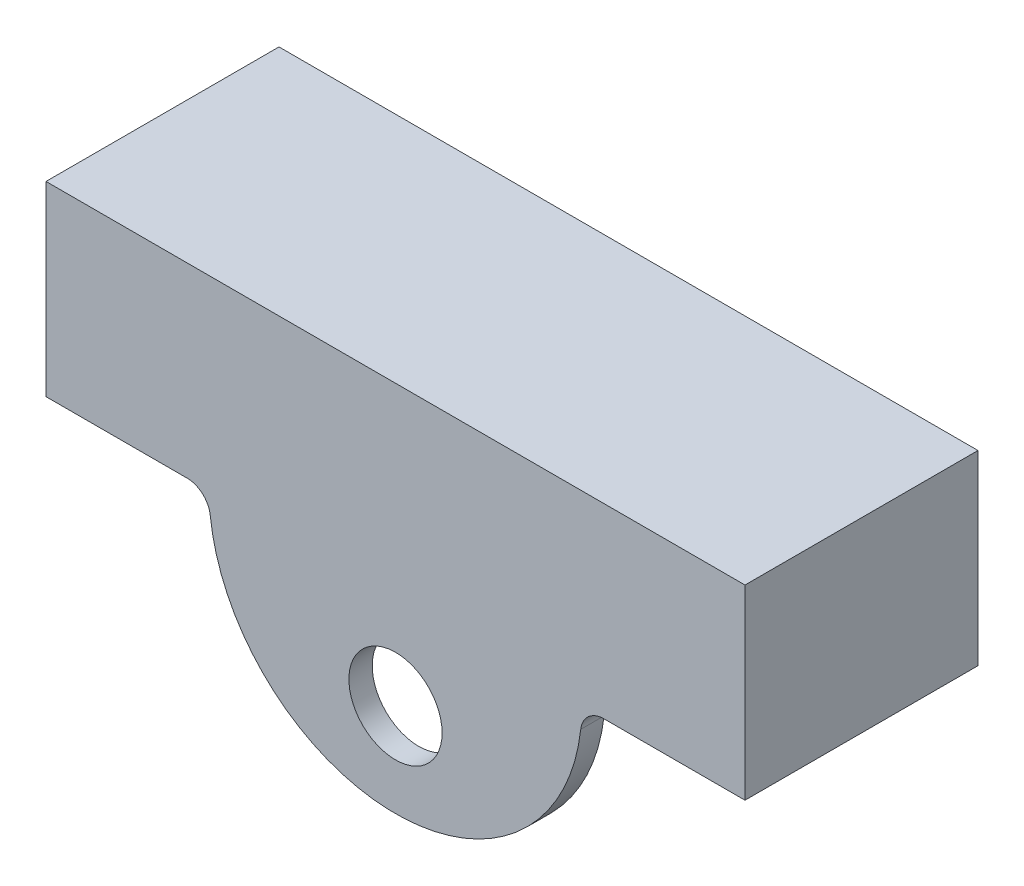
ISO-10303-21;
HEADER;
FILE_DESCRIPTION(('STEP AP214'),'2;1');
FILE_NAME('part.step','',(''),(''),'','','');
FILE_SCHEMA(('AUTOMOTIVE_DESIGN { 1 0 10303 214 1 1 1 1 }'));
ENDSEC;
DATA;
#1=APPLICATION_CONTEXT('core data for automotive mechanical design processes');
#2=APPLICATION_PROTOCOL_DEFINITION('international standard','automotive_design',2000,#1);
#3=PRODUCT_CONTEXT('',#1,'mechanical');
#4=PRODUCT('Part','Part','',(#3));
#5=PRODUCT_RELATED_PRODUCT_CATEGORY('part','',(#4));
#6=PRODUCT_DEFINITION_FORMATION('','',#4);
#7=PRODUCT_DEFINITION_CONTEXT('part definition',#1,'design');
#8=PRODUCT_DEFINITION('design','',#6,#7);
#9=PRODUCT_DEFINITION_SHAPE('','',#8);
#10=(LENGTH_UNIT() NAMED_UNIT(*) SI_UNIT(.MILLI.,.METRE.));
#11=(NAMED_UNIT(*) PLANE_ANGLE_UNIT() SI_UNIT($,.RADIAN.));
#12=(NAMED_UNIT(*) SI_UNIT($,.STERADIAN.) SOLID_ANGLE_UNIT());
#13=UNCERTAINTY_MEASURE_WITH_UNIT(LENGTH_MEASURE(1.E-05),#10,'distance_accuracy_value','');
#14=(GEOMETRIC_REPRESENTATION_CONTEXT(3) GLOBAL_UNCERTAINTY_ASSIGNED_CONTEXT((#13)) GLOBAL_UNIT_ASSIGNED_CONTEXT((#10,
#11,#12)) REPRESENTATION_CONTEXT('',''));
#15=CARTESIAN_POINT('',(0.,0.,0.));
#16=DIRECTION('',(0.,0.,1.));
#17=DIRECTION('',(1.,0.,0.));
#18=AXIS2_PLACEMENT_3D('',#15,#16,#17);
#19=CARTESIAN_POINT('',(0.,-40.,50.));
#20=DIRECTION('',(0.,-1.,0.));
#21=DIRECTION('',(1.,0.,0.));
#22=AXIS2_PLACEMENT_3D('',#19,#20,#21);
#23=PLANE('',#22);
#24=DIRECTION('',(-1.,0.,0.));
#25=VECTOR('',#24,1.);
#26=CARTESIAN_POINT('',(0.,-40.,0.));
#27=LINE('',#26,#25);
#28=CARTESIAN_POINT('',(-44.7213595499958,-40.,0.));
#29=VERTEX_POINT('',#28);
#30=CARTESIAN_POINT('',(-75.,-40.,0.));
#31=VERTEX_POINT('',#30);
#32=EDGE_CURVE('E244',#29,#31,#27,.T.);
#33=ORIENTED_EDGE('',*,*,#32,.F.);
#34=DIRECTION('',(0.,0.,-1.));
#35=VECTOR('',#34,1.);
#36=CARTESIAN_POINT('',(-44.7213595499958,-40.,50.));
#37=LINE('',#36,#35);
#38=CARTESIAN_POINT('',(-44.7213595499958,-40.,5.));
#39=VERTEX_POINT('',#38);
#40=EDGE_CURVE('E280',#29,#39,#37,.F.);
#41=ORIENTED_EDGE('',*,*,#40,.T.);
#42=DIRECTION('',(-1.,0.,0.));
#43=VECTOR('',#42,1.);
#44=CARTESIAN_POINT('',(0.,-40.,5.));
#45=LINE('',#44,#43);
#46=CARTESIAN_POINT('',(-70.,-40.,5.));
#47=VERTEX_POINT('',#46);
#48=EDGE_CURVE('E203',#39,#47,#45,.T.);
#49=ORIENTED_EDGE('',*,*,#48,.T.);
#50=DIRECTION('',(0.,0.,-1.));
#51=VECTOR('',#50,1.);
#52=CARTESIAN_POINT('',(-70.,-40.,50.));
#53=LINE('',#52,#51);
#54=CARTESIAN_POINT('',(-70.,-40.,45.));
#55=VERTEX_POINT('',#54);
#56=EDGE_CURVE('E208',#55,#47,#53,.T.);
#57=ORIENTED_EDGE('',*,*,#56,.F.);
#58=DIRECTION('',(-1.,0.,0.));
#59=VECTOR('',#58,1.);
#60=CARTESIAN_POINT('',(0.,-40.,45.));
#61=LINE('',#60,#59);
#62=CARTESIAN_POINT('',(-44.7213595499958,-40.,45.));
#63=VERTEX_POINT('',#62);
#64=EDGE_CURVE('E206',#63,#55,#61,.T.);
#65=ORIENTED_EDGE('',*,*,#64,.F.);
#66=DIRECTION('',(0.,0.,-1.));
#67=VECTOR('',#66,1.);
#68=CARTESIAN_POINT('',(-44.7213595499958,-40.,50.));
#69=LINE('',#68,#67);
#70=CARTESIAN_POINT('',(-44.7213595499958,-40.,50.));
#71=VERTEX_POINT('',#70);
#72=EDGE_CURVE('E80',#63,#71,#69,.F.);
#73=ORIENTED_EDGE('',*,*,#72,.T.);
#74=DIRECTION('',(-1.,0.,0.));
#75=VECTOR('',#74,1.);
#76=CARTESIAN_POINT('',(0.,-40.,50.));
#77=LINE('',#76,#75);
#78=CARTESIAN_POINT('',(-75.,-40.,50.));
#79=VERTEX_POINT('',#78);
#80=EDGE_CURVE('E228',#71,#79,#77,.T.);
#81=ORIENTED_EDGE('',*,*,#80,.T.);
#82=DIRECTION('',(0.,0.,-1.));
#83=VECTOR('',#82,1.);
#84=CARTESIAN_POINT('',(-75.,-40.,50.));
#85=LINE('',#84,#83);
#86=EDGE_CURVE('E260',#79,#31,#85,.T.);
#87=ORIENTED_EDGE('',*,*,#86,.T.);
#88=EDGE_LOOP('',(#33,#41,#49,#57,#65,#73,#81,#87));
#89=FACE_BOUND('',#88,.T.);
#90=ADVANCED_FACE('F56',(#89),#23,.T.);
#91=CARTESIAN_POINT('',(0.,-40.,50.));
#92=DIRECTION('',(0.,0.,-1.));
#93=DIRECTION('',(-1.,0.,0.));
#94=AXIS2_PLACEMENT_3D('',#91,#92,#93);
#95=CYLINDRICAL_SURFACE('',#94,40.);
#96=CARTESIAN_POINT('',(0.,-40.,0.));
#97=DIRECTION('',(0.,0.,1.));
#98=DIRECTION('',(1.,0.,0.));
#99=AXIS2_PLACEMENT_3D('',#96,#97,#98);
#100=CIRCLE('',#99,40.);
#101=CARTESIAN_POINT('',(-39.7523195999963,-44.4444444444444,0.));
#102=VERTEX_POINT('',#101);
#103=CARTESIAN_POINT('',(39.7523195999963,-44.4444444444444,0.));
#104=VERTEX_POINT('',#103);
#105=EDGE_CURVE('E246',#102,#104,#100,.T.);
#106=ORIENTED_EDGE('',*,*,#105,.T.);
#107=DIRECTION('',(0.,0.,-1.));
#108=VECTOR('',#107,1.);
#109=CARTESIAN_POINT('',(39.7523195999963,-44.4444444444444,50.));
#110=LINE('',#109,#108);
#111=CARTESIAN_POINT('',(39.7523195999963,-44.4444444444444,5.));
#112=VERTEX_POINT('',#111);
#113=EDGE_CURVE('E272',#104,#112,#110,.F.);
#114=ORIENTED_EDGE('',*,*,#113,.T.);
#115=CARTESIAN_POINT('',(0.,-40.,5.));
#116=DIRECTION('',(0.,0.,1.));
#117=DIRECTION('',(1.,0.,0.));
#118=AXIS2_PLACEMENT_3D('',#115,#116,#117);
#119=CIRCLE('',#118,40.);
#120=CARTESIAN_POINT('',(-39.7523195999963,-44.4444444444444,5.));
#121=VERTEX_POINT('',#120);
#122=EDGE_CURVE('E218',#121,#112,#119,.T.);
#123=ORIENTED_EDGE('',*,*,#122,.F.);
#124=DIRECTION('',(0.,0.,-1.));
#125=VECTOR('',#124,1.);
#126=CARTESIAN_POINT('',(-39.7523195999963,-44.4444444444444,50.));
#127=LINE('',#126,#125);
#128=EDGE_CURVE('E269',#121,#102,#127,.T.);
#129=ORIENTED_EDGE('',*,*,#128,.T.);
#130=EDGE_LOOP('',(#106,#114,#123,#129));
#131=FACE_BOUND('',#130,.T.);
#132=ADVANCED_FACE('F339',(#131),#95,.T.);
#133=DIRECTION('',(-1.,0.,0.));
#134=VECTOR('',#133,1.);
#135=CARTESIAN_POINT('',(0.,-40.,5.));
#136=LINE('',#135,#134);
#137=CARTESIAN_POINT('',(70.,-40.,5.));
#138=VERTEX_POINT('',#137);
#139=CARTESIAN_POINT('',(44.7213595499958,-40.,5.));
#140=VERTEX_POINT('',#139);
#141=EDGE_CURVE('E221',#138,#140,#136,.T.);
#142=ORIENTED_EDGE('',*,*,#141,.T.);
#143=DIRECTION('',(0.,0.,-1.));
#144=VECTOR('',#143,1.);
#145=CARTESIAN_POINT('',(44.7213595499958,-40.,50.));
#146=LINE('',#145,#144);
#147=CARTESIAN_POINT('',(44.7213595499958,-40.,0.));
#148=VERTEX_POINT('',#147);
#149=EDGE_CURVE('E266',#140,#148,#146,.T.);
#150=ORIENTED_EDGE('',*,*,#149,.T.);
#151=CARTESIAN_POINT('',(75.,-40.,0.));
#152=VERTEX_POINT('',#151);
#153=EDGE_CURVE('E247',#152,#148,#27,.T.);
#154=ORIENTED_EDGE('',*,*,#153,.F.);
#155=DIRECTION('',(0.,0.,-1.));
#156=VECTOR('',#155,1.);
#157=CARTESIAN_POINT('',(75.,-40.,50.));
#158=LINE('',#157,#156);
#159=CARTESIAN_POINT('',(75.,-40.,50.));
#160=VERTEX_POINT('',#159);
#161=EDGE_CURVE('E258',#160,#152,#158,.T.);
#162=ORIENTED_EDGE('',*,*,#161,.F.);
#163=CARTESIAN_POINT('',(44.7213595499958,-40.,50.));
#164=VERTEX_POINT('',#163);
#165=EDGE_CURVE('E232',#160,#164,#77,.T.);
#166=ORIENTED_EDGE('',*,*,#165,.T.);
#167=DIRECTION('',(0.,0.,-1.));
#168=VECTOR('',#167,1.);
#169=CARTESIAN_POINT('',(44.7213595499958,-40.,50.));
#170=LINE('',#169,#168);
#171=CARTESIAN_POINT('',(44.7213595499958,-40.,45.));
#172=VERTEX_POINT('',#171);
#173=EDGE_CURVE('E263',#164,#172,#170,.T.);
#174=ORIENTED_EDGE('',*,*,#173,.T.);
#175=DIRECTION('',(-1.,0.,0.));
#176=VECTOR('',#175,1.);
#177=CARTESIAN_POINT('',(0.,-40.,45.));
#178=LINE('',#177,#176);
#179=CARTESIAN_POINT('',(70.,-40.,45.));
#180=VERTEX_POINT('',#179);
#181=EDGE_CURVE('E190',#180,#172,#178,.T.);
#182=ORIENTED_EDGE('',*,*,#181,.F.);
#183=DIRECTION('',(0.,0.,-1.));
#184=VECTOR('',#183,1.);
#185=CARTESIAN_POINT('',(70.,-40.,50.));
#186=LINE('',#185,#184);
#187=EDGE_CURVE('E180',#180,#138,#186,.T.);
#188=ORIENTED_EDGE('',*,*,#187,.T.);
#189=EDGE_LOOP('',(#142,#150,#154,#162,#166,#174,#182,#188));
#190=FACE_BOUND('',#189,.T.);
#191=ADVANCED_FACE('F313',(#190),#23,.T.);
#192=CARTESIAN_POINT('',(0.,-40.,45.));
#193=DIRECTION('',(0.,0.,1.));
#194=DIRECTION('',(1.,0.,0.));
#195=AXIS2_PLACEMENT_3D('',#192,#193,#194);
#196=CIRCLE('',#195,40.);
#197=CARTESIAN_POINT('',(-39.7523195999963,-44.4444444444444,45.));
#198=VERTEX_POINT('',#197);
#199=CARTESIAN_POINT('',(39.7523195999963,-44.4444444444444,45.));
#200=VERTEX_POINT('',#199);
#201=EDGE_CURVE('E210',#198,#200,#196,.T.);
#202=ORIENTED_EDGE('',*,*,#201,.T.);
#203=DIRECTION('',(0.,0.,-1.));
#204=VECTOR('',#203,1.);
#205=CARTESIAN_POINT('',(39.7523195999963,-44.4444444444444,50.));
#206=LINE('',#205,#204);
#207=CARTESIAN_POINT('',(39.7523195999963,-44.4444444444444,50.));
#208=VERTEX_POINT('',#207);
#209=EDGE_CURVE('E277',#200,#208,#206,.F.);
#210=ORIENTED_EDGE('',*,*,#209,.T.);
#211=CARTESIAN_POINT('',(0.,-40.,50.));
#212=DIRECTION('',(0.,0.,1.));
#213=DIRECTION('',(1.,0.,0.));
#214=AXIS2_PLACEMENT_3D('',#211,#212,#213);
#215=CIRCLE('',#214,40.);
#216=CARTESIAN_POINT('',(-39.7523195999963,-44.4444444444444,50.));
#217=VERTEX_POINT('',#216);
#218=EDGE_CURVE('E231',#217,#208,#215,.T.);
#219=ORIENTED_EDGE('',*,*,#218,.F.);
#220=DIRECTION('',(0.,0.,-1.));
#221=VECTOR('',#220,1.);
#222=CARTESIAN_POINT('',(-39.7523195999963,-44.4444444444444,50.));
#223=LINE('',#222,#221);
#224=EDGE_CURVE('E274',#217,#198,#223,.T.);
#225=ORIENTED_EDGE('',*,*,#224,.T.);
#226=EDGE_LOOP('',(#202,#210,#219,#225));
#227=FACE_BOUND('',#226,.T.);
#228=ADVANCED_FACE('F304',(#227),#95,.T.);
#229=CARTESIAN_POINT('',(75.,0.,50.));
#230=DIRECTION('',(1.,0.,0.));
#231=DIRECTION('',(0.,1.,0.));
#232=AXIS2_PLACEMENT_3D('',#229,#230,#231);
#233=PLANE('',#232);
#234=DIRECTION('',(0.,-1.,0.));
#235=VECTOR('',#234,1.);
#236=CARTESIAN_POINT('',(75.,0.,0.));
#237=LINE('',#236,#235);
#238=CARTESIAN_POINT('',(75.,0.,0.));
#239=VERTEX_POINT('',#238);
#240=EDGE_CURVE('E250',#239,#152,#237,.T.);
#241=ORIENTED_EDGE('',*,*,#240,.F.);
#242=DIRECTION('',(0.,0.,-1.));
#243=VECTOR('',#242,1.);
#244=CARTESIAN_POINT('',(75.,0.,50.));
#245=LINE('',#244,#243);
#246=CARTESIAN_POINT('',(75.,0.,50.));
#247=VERTEX_POINT('',#246);
#248=EDGE_CURVE('E256',#247,#239,#245,.T.);
#249=ORIENTED_EDGE('',*,*,#248,.F.);
#250=DIRECTION('',(0.,-1.,0.));
#251=VECTOR('',#250,1.);
#252=CARTESIAN_POINT('',(75.,0.,50.));
#253=LINE('',#252,#251);
#254=EDGE_CURVE('E235',#247,#160,#253,.T.);
#255=ORIENTED_EDGE('',*,*,#254,.T.);
#256=ORIENTED_EDGE('',*,*,#161,.T.);
#257=EDGE_LOOP('',(#241,#249,#255,#256));
#258=FACE_BOUND('',#257,.T.);
#259=ADVANCED_FACE('F318',(#258),#233,.T.);
#260=CARTESIAN_POINT('',(0.,0.,50.));
#261=DIRECTION('',(0.,1.,0.));
#262=DIRECTION('',(-1.,0.,0.));
#263=AXIS2_PLACEMENT_3D('',#260,#261,#262);
#264=PLANE('',#263);
#265=DIRECTION('',(1.,0.,0.));
#266=VECTOR('',#265,1.);
#267=CARTESIAN_POINT('',(0.,0.,0.));
#268=LINE('',#267,#266);
#269=CARTESIAN_POINT('',(-75.,0.,0.));
#270=VERTEX_POINT('',#269);
#271=EDGE_CURVE('E229',#270,#239,#268,.T.);
#272=ORIENTED_EDGE('',*,*,#271,.F.);
#273=DIRECTION('',(0.,0.,-1.));
#274=VECTOR('',#273,1.);
#275=CARTESIAN_POINT('',(-75.,0.,50.));
#276=LINE('',#275,#274);
#277=CARTESIAN_POINT('',(-75.,0.,50.));
#278=VERTEX_POINT('',#277);
#279=EDGE_CURVE('E241',#278,#270,#276,.T.);
#280=ORIENTED_EDGE('',*,*,#279,.F.);
#281=DIRECTION('',(1.,0.,0.));
#282=VECTOR('',#281,1.);
#283=CARTESIAN_POINT('',(0.,0.,50.));
#284=LINE('',#283,#282);
#285=EDGE_CURVE('E238',#278,#247,#284,.T.);
#286=ORIENTED_EDGE('',*,*,#285,.T.);
#287=ORIENTED_EDGE('',*,*,#248,.T.);
#288=EDGE_LOOP('',(#272,#280,#286,#287));
#289=FACE_BOUND('',#288,.T.);
#290=ADVANCED_FACE('F322',(#289),#264,.T.);
#291=CARTESIAN_POINT('',(-75.,0.,50.));
#292=DIRECTION('',(-1.,0.,0.));
#293=DIRECTION('',(0.,-1.,0.));
#294=AXIS2_PLACEMENT_3D('',#291,#292,#293);
#295=PLANE('',#294);
#296=DIRECTION('',(0.,1.,0.));
#297=VECTOR('',#296,1.);
#298=CARTESIAN_POINT('',(-75.,0.,0.));
#299=LINE('',#298,#297);
#300=EDGE_CURVE('E216',#31,#270,#299,.T.);
#301=ORIENTED_EDGE('',*,*,#300,.F.);
#302=ORIENTED_EDGE('',*,*,#86,.F.);
#303=DIRECTION('',(0.,1.,0.));
#304=VECTOR('',#303,1.);
#305=CARTESIAN_POINT('',(-75.,0.,50.));
#306=LINE('',#305,#304);
#307=EDGE_CURVE('E225',#79,#278,#306,.T.);
#308=ORIENTED_EDGE('',*,*,#307,.T.);
#309=ORIENTED_EDGE('',*,*,#279,.T.);
#310=EDGE_LOOP('',(#301,#302,#308,#309));
#311=FACE_BOUND('',#310,.T.);
#312=ADVANCED_FACE('F326',(#311),#295,.T.);
#313=CARTESIAN_POINT('',(0.,0.,0.));
#314=DIRECTION('',(0.,0.,1.));
#315=DIRECTION('',(1.,0.,0.));
#316=AXIS2_PLACEMENT_3D('',#313,#314,#315);
#317=PLANE('',#316);
#318=CARTESIAN_POINT('',(0.,-60.,0.));
#319=DIRECTION('',(0.,0.,1.));
#320=DIRECTION('',(1.,0.,0.));
#321=AXIS2_PLACEMENT_3D('',#318,#319,#320);
#322=CIRCLE('',#321,10.);
#323=CARTESIAN_POINT('',(10.,-60.,0.));
#324=VERTEX_POINT('',#323);
#325=EDGE_CURVE('E204',#324,#324,#322,.T.);
#326=ORIENTED_EDGE('',*,*,#325,.T.);
#327=EDGE_LOOP('',(#326));
#328=FACE_BOUND('',#327,.T.);
#329=ORIENTED_EDGE('',*,*,#300,.T.);
#330=ORIENTED_EDGE('',*,*,#271,.T.);
#331=ORIENTED_EDGE('',*,*,#240,.T.);
#332=ORIENTED_EDGE('',*,*,#153,.T.);
#333=CARTESIAN_POINT('',(44.7213595499958,-45.,0.));
#334=DIRECTION('',(0.,0.,1.));
#335=DIRECTION('',(1.,0.,0.));
#336=AXIS2_PLACEMENT_3D('',#333,#334,#335);
#337=CIRCLE('',#336,5.);
#338=EDGE_CURVE('E282',#148,#104,#337,.T.);
#339=ORIENTED_EDGE('',*,*,#338,.T.);
#340=ORIENTED_EDGE('',*,*,#105,.F.);
#341=CARTESIAN_POINT('',(-44.7213595499958,-45.,0.));
#342=DIRECTION('',(0.,0.,1.));
#343=DIRECTION('',(1.,0.,0.));
#344=AXIS2_PLACEMENT_3D('',#341,#342,#343);
#345=CIRCLE('',#344,5.);
#346=EDGE_CURVE('E72',#102,#29,#345,.T.);
#347=ORIENTED_EDGE('',*,*,#346,.T.);
#348=ORIENTED_EDGE('',*,*,#32,.T.);
#349=EDGE_LOOP('',(#329,#330,#331,#332,#339,#340,#347,#348));
#350=FACE_BOUND('',#349,.T.);
#351=ADVANCED_FACE('F344',(#328,#350),#317,.F.);
#352=CARTESIAN_POINT('',(0.,0.,50.));
#353=DIRECTION('',(0.,0.,1.));
#354=DIRECTION('',(1.,0.,0.));
#355=AXIS2_PLACEMENT_3D('',#352,#353,#354);
#356=PLANE('',#355);
#357=CARTESIAN_POINT('',(0.,-60.,50.));
#358=DIRECTION('',(0.,0.,1.));
#359=DIRECTION('',(1.,0.,0.));
#360=AXIS2_PLACEMENT_3D('',#357,#358,#359);
#361=CIRCLE('',#360,10.);
#362=CARTESIAN_POINT('',(10.,-60.,50.));
#363=VERTEX_POINT('',#362);
#364=EDGE_CURVE('E411',#363,#363,#361,.T.);
#365=ORIENTED_EDGE('',*,*,#364,.F.);
#366=EDGE_LOOP('',(#365));
#367=FACE_BOUND('',#366,.T.);
#368=ORIENTED_EDGE('',*,*,#307,.F.);
#369=ORIENTED_EDGE('',*,*,#80,.F.);
#370=CARTESIAN_POINT('',(-44.7213595499958,-45.,50.));
#371=DIRECTION('',(0.,0.,1.));
#372=DIRECTION('',(1.,0.,0.));
#373=AXIS2_PLACEMENT_3D('',#370,#371,#372);
#374=CIRCLE('',#373,5.);
#375=EDGE_CURVE('E12',#71,#217,#374,.F.);
#376=ORIENTED_EDGE('',*,*,#375,.T.);
#377=ORIENTED_EDGE('',*,*,#218,.T.);
#378=CARTESIAN_POINT('',(44.7213595499958,-45.,50.));
#379=DIRECTION('',(0.,0.,1.));
#380=DIRECTION('',(1.,0.,0.));
#381=AXIS2_PLACEMENT_3D('',#378,#379,#380);
#382=CIRCLE('',#381,5.);
#383=EDGE_CURVE('E288',#208,#164,#382,.F.);
#384=ORIENTED_EDGE('',*,*,#383,.T.);
#385=ORIENTED_EDGE('',*,*,#165,.F.);
#386=ORIENTED_EDGE('',*,*,#254,.F.);
#387=ORIENTED_EDGE('',*,*,#285,.F.);
#388=EDGE_LOOP('',(#368,#369,#376,#377,#384,#385,#386,#387));
#389=FACE_BOUND('',#388,.T.);
#390=ADVANCED_FACE('F301',(#367,#389),#356,.T.);
#391=CARTESIAN_POINT('',(70.,0.,50.));
#392=DIRECTION('',(1.,0.,0.));
#393=DIRECTION('',(0.,1.,0.));
#394=AXIS2_PLACEMENT_3D('',#391,#392,#393);
#395=PLANE('',#394);
#396=DIRECTION('',(0.,-1.,0.));
#397=VECTOR('',#396,1.);
#398=CARTESIAN_POINT('',(70.,0.,5.));
#399=LINE('',#398,#397);
#400=CARTESIAN_POINT('',(70.,-4.99999999999999,5.));
#401=VERTEX_POINT('',#400);
#402=EDGE_CURVE('E224',#401,#138,#399,.T.);
#403=ORIENTED_EDGE('',*,*,#402,.T.);
#404=ORIENTED_EDGE('',*,*,#187,.F.);
#405=DIRECTION('',(0.,-1.,0.));
#406=VECTOR('',#405,1.);
#407=CARTESIAN_POINT('',(70.,0.,45.));
#408=LINE('',#407,#406);
#409=CARTESIAN_POINT('',(70.,-4.99999999999999,45.));
#410=VERTEX_POINT('',#409);
#411=EDGE_CURVE('E184',#410,#180,#408,.T.);
#412=ORIENTED_EDGE('',*,*,#411,.F.);
#413=DIRECTION('',(0.,0.,-1.));
#414=VECTOR('',#413,1.);
#415=CARTESIAN_POINT('',(70.,-4.99999999999999,50.));
#416=LINE('',#415,#414);
#417=EDGE_CURVE('E170',#410,#401,#416,.T.);
#418=ORIENTED_EDGE('',*,*,#417,.T.);
#419=EDGE_LOOP('',(#403,#404,#412,#418));
#420=FACE_BOUND('',#419,.T.);
#421=ADVANCED_FACE('F185',(#420),#395,.F.);
#422=CARTESIAN_POINT('',(0.,-5.,50.));
#423=DIRECTION('',(0.,1.,0.));
#424=DIRECTION('',(-1.,0.,0.));
#425=AXIS2_PLACEMENT_3D('',#422,#423,#424);
#426=PLANE('',#425);
#427=DIRECTION('',(1.,0.,0.));
#428=VECTOR('',#427,1.);
#429=CARTESIAN_POINT('',(0.,-5.,5.));
#430=LINE('',#429,#428);
#431=CARTESIAN_POINT('',(-70.,-5.00000000000001,5.));
#432=VERTEX_POINT('',#431);
#433=EDGE_CURVE('E176',#432,#401,#430,.T.);
#434=ORIENTED_EDGE('',*,*,#433,.T.);
#435=ORIENTED_EDGE('',*,*,#417,.F.);
#436=DIRECTION('',(1.,0.,0.));
#437=VECTOR('',#436,1.);
#438=CARTESIAN_POINT('',(0.,-5.,45.));
#439=LINE('',#438,#437);
#440=CARTESIAN_POINT('',(-70.,-5.00000000000001,45.));
#441=VERTEX_POINT('',#440);
#442=EDGE_CURVE('E174',#441,#410,#439,.T.);
#443=ORIENTED_EDGE('',*,*,#442,.F.);
#444=DIRECTION('',(0.,0.,-1.));
#445=VECTOR('',#444,1.);
#446=CARTESIAN_POINT('',(-70.,-5.00000000000001,50.));
#447=LINE('',#446,#445);
#448=EDGE_CURVE('E181',#441,#432,#447,.T.);
#449=ORIENTED_EDGE('',*,*,#448,.T.);
#450=EDGE_LOOP('',(#434,#435,#443,#449));
#451=FACE_BOUND('',#450,.T.);
#452=ADVANCED_FACE('F172',(#451),#426,.F.);
#453=CARTESIAN_POINT('',(-70.,0.,50.));
#454=DIRECTION('',(-1.,0.,0.));
#455=DIRECTION('',(0.,-1.,0.));
#456=AXIS2_PLACEMENT_3D('',#453,#454,#455);
#457=PLANE('',#456);
#458=DIRECTION('',(0.,1.,0.));
#459=VECTOR('',#458,1.);
#460=CARTESIAN_POINT('',(-70.,0.,5.));
#461=LINE('',#460,#459);
#462=EDGE_CURVE('E200',#47,#432,#461,.T.);
#463=ORIENTED_EDGE('',*,*,#462,.T.);
#464=ORIENTED_EDGE('',*,*,#448,.F.);
#465=DIRECTION('',(0.,1.,0.));
#466=VECTOR('',#465,1.);
#467=CARTESIAN_POINT('',(-70.,0.,45.));
#468=LINE('',#467,#466);
#469=EDGE_CURVE('E195',#55,#441,#468,.T.);
#470=ORIENTED_EDGE('',*,*,#469,.F.);
#471=ORIENTED_EDGE('',*,*,#56,.T.);
#472=EDGE_LOOP('',(#463,#464,#470,#471));
#473=FACE_BOUND('',#472,.T.);
#474=ADVANCED_FACE('F397',(#473),#457,.F.);
#475=CARTESIAN_POINT('',(0.,0.,5.));
#476=DIRECTION('',(0.,0.,1.));
#477=DIRECTION('',(1.,0.,0.));
#478=AXIS2_PLACEMENT_3D('',#475,#476,#477);
#479=PLANE('',#478);
#480=CARTESIAN_POINT('',(0.,-60.,5.));
#481=DIRECTION('',(0.,0.,1.));
#482=DIRECTION('',(1.,0.,0.));
#483=AXIS2_PLACEMENT_3D('',#480,#481,#482);
#484=CIRCLE('',#483,10.);
#485=CARTESIAN_POINT('',(10.,-60.,5.));
#486=VERTEX_POINT('',#485);
#487=EDGE_CURVE('E410',#486,#486,#484,.T.);
#488=ORIENTED_EDGE('',*,*,#487,.F.);
#489=EDGE_LOOP('',(#488));
#490=FACE_BOUND('',#489,.T.);
#491=ORIENTED_EDGE('',*,*,#462,.F.);
#492=ORIENTED_EDGE('',*,*,#48,.F.);
#493=CARTESIAN_POINT('',(-44.7213595499958,-45.,5.));
#494=DIRECTION('',(0.,0.,1.));
#495=DIRECTION('',(1.,0.,0.));
#496=AXIS2_PLACEMENT_3D('',#493,#494,#495);
#497=CIRCLE('',#496,5.);
#498=EDGE_CURVE('E291',#39,#121,#497,.F.);
#499=ORIENTED_EDGE('',*,*,#498,.T.);
#500=ORIENTED_EDGE('',*,*,#122,.T.);
#501=CARTESIAN_POINT('',(44.7213595499958,-45.,5.));
#502=DIRECTION('',(0.,0.,1.));
#503=DIRECTION('',(1.,0.,0.));
#504=AXIS2_PLACEMENT_3D('',#501,#502,#503);
#505=CIRCLE('',#504,5.);
#506=EDGE_CURVE('E284',#112,#140,#505,.F.);
#507=ORIENTED_EDGE('',*,*,#506,.T.);
#508=ORIENTED_EDGE('',*,*,#141,.F.);
#509=ORIENTED_EDGE('',*,*,#402,.F.);
#510=ORIENTED_EDGE('',*,*,#433,.F.);
#511=EDGE_LOOP('',(#491,#492,#499,#500,#507,#508,#509,#510));
#512=FACE_BOUND('',#511,.T.);
#513=ADVANCED_FACE('F336',(#490,#512),#479,.T.);
#514=CARTESIAN_POINT('',(0.,0.,45.));
#515=DIRECTION('',(0.,0.,1.));
#516=DIRECTION('',(1.,0.,0.));
#517=AXIS2_PLACEMENT_3D('',#514,#515,#516);
#518=PLANE('',#517);
#519=CARTESIAN_POINT('',(0.,-60.,45.));
#520=DIRECTION('',(0.,0.,1.));
#521=DIRECTION('',(1.,0.,0.));
#522=AXIS2_PLACEMENT_3D('',#519,#520,#521);
#523=CIRCLE('',#522,10.);
#524=CARTESIAN_POINT('',(10.,-60.,45.));
#525=VERTEX_POINT('',#524);
#526=EDGE_CURVE('E60',#525,#525,#523,.T.);
#527=ORIENTED_EDGE('',*,*,#526,.T.);
#528=EDGE_LOOP('',(#527));
#529=FACE_BOUND('',#528,.T.);
#530=ORIENTED_EDGE('',*,*,#469,.T.);
#531=ORIENTED_EDGE('',*,*,#442,.T.);
#532=ORIENTED_EDGE('',*,*,#411,.T.);
#533=ORIENTED_EDGE('',*,*,#181,.T.);
#534=CARTESIAN_POINT('',(44.7213595499958,-45.,45.));
#535=DIRECTION('',(0.,0.,1.));
#536=DIRECTION('',(1.,0.,0.));
#537=AXIS2_PLACEMENT_3D('',#534,#535,#536);
#538=CIRCLE('',#537,5.);
#539=EDGE_CURVE('E286',#172,#200,#538,.T.);
#540=ORIENTED_EDGE('',*,*,#539,.T.);
#541=ORIENTED_EDGE('',*,*,#201,.F.);
#542=CARTESIAN_POINT('',(-44.7213595499958,-45.,45.));
#543=DIRECTION('',(0.,0.,1.));
#544=DIRECTION('',(1.,0.,0.));
#545=AXIS2_PLACEMENT_3D('',#542,#543,#544);
#546=CIRCLE('',#545,5.);
#547=EDGE_CURVE('E65',#198,#63,#546,.T.);
#548=ORIENTED_EDGE('',*,*,#547,.T.);
#549=ORIENTED_EDGE('',*,*,#64,.T.);
#550=EDGE_LOOP('',(#530,#531,#532,#533,#540,#541,#548,#549));
#551=FACE_BOUND('',#550,.T.);
#552=ADVANCED_FACE('F193',(#529,#551),#518,.F.);
#553=CARTESIAN_POINT('',(44.7213595499958,-45.,50.));
#554=DIRECTION('',(0.,0.,-1.));
#555=DIRECTION('',(-1.,0.,0.));
#556=AXIS2_PLACEMENT_3D('',#553,#554,#555);
#557=CYLINDRICAL_SURFACE('',#556,5.);
#558=ORIENTED_EDGE('',*,*,#506,.F.);
#559=ORIENTED_EDGE('',*,*,#113,.F.);
#560=ORIENTED_EDGE('',*,*,#338,.F.);
#561=ORIENTED_EDGE('',*,*,#149,.F.);
#562=EDGE_LOOP('',(#558,#559,#560,#561));
#563=FACE_BOUND('',#562,.T.);
#564=ADVANCED_FACE('F342',(#563),#557,.F.);
#565=CARTESIAN_POINT('',(44.7213595499958,-45.,50.));
#566=DIRECTION('',(0.,0.,-1.));
#567=DIRECTION('',(-1.,0.,0.));
#568=AXIS2_PLACEMENT_3D('',#565,#566,#567);
#569=CYLINDRICAL_SURFACE('',#568,5.);
#570=ORIENTED_EDGE('',*,*,#383,.F.);
#571=ORIENTED_EDGE('',*,*,#209,.F.);
#572=ORIENTED_EDGE('',*,*,#539,.F.);
#573=ORIENTED_EDGE('',*,*,#173,.F.);
#574=EDGE_LOOP('',(#570,#571,#572,#573));
#575=FACE_BOUND('',#574,.T.);
#576=ADVANCED_FACE('F307',(#575),#569,.F.);
#577=CARTESIAN_POINT('',(-44.7213595499958,-45.,50.));
#578=DIRECTION('',(0.,0.,-1.));
#579=DIRECTION('',(-1.,0.,0.));
#580=AXIS2_PLACEMENT_3D('',#577,#578,#579);
#581=CYLINDRICAL_SURFACE('',#580,5.);
#582=ORIENTED_EDGE('',*,*,#498,.F.);
#583=ORIENTED_EDGE('',*,*,#40,.F.);
#584=ORIENTED_EDGE('',*,*,#346,.F.);
#585=ORIENTED_EDGE('',*,*,#128,.F.);
#586=EDGE_LOOP('',(#582,#583,#584,#585));
#587=FACE_BOUND('',#586,.T.);
#588=ADVANCED_FACE('F331',(#587),#581,.F.);
#589=CARTESIAN_POINT('',(-44.7213595499958,-45.,50.));
#590=DIRECTION('',(0.,0.,-1.));
#591=DIRECTION('',(-1.,0.,0.));
#592=AXIS2_PLACEMENT_3D('',#589,#590,#591);
#593=CYLINDRICAL_SURFACE('',#592,5.);
#594=ORIENTED_EDGE('',*,*,#375,.F.);
#595=ORIENTED_EDGE('',*,*,#72,.F.);
#596=ORIENTED_EDGE('',*,*,#547,.F.);
#597=ORIENTED_EDGE('',*,*,#224,.F.);
#598=EDGE_LOOP('',(#594,#595,#596,#597));
#599=FACE_BOUND('',#598,.T.);
#600=ADVANCED_FACE('F58',(#599),#593,.F.);
#601=CARTESIAN_POINT('',(0.,-60.,-1.2E-05));
#602=DIRECTION('',(0.,0.,1.));
#603=DIRECTION('',(1.,0.,0.));
#604=AXIS2_PLACEMENT_3D('',#601,#602,#603);
#605=CYLINDRICAL_SURFACE('',#604,10.);
#606=CARTESIAN_POINT('',(10.,-60.,50.));
#607=CARTESIAN_POINT('',(10.,-60.,49.9479166666667));
#608=CARTESIAN_POINT('',(10.,-60.,49.8958333333333));
#609=CARTESIAN_POINT('',(10.,-60.,49.7916666666667));
#610=CARTESIAN_POINT('',(10.,-60.,49.7395833333333));
#611=CARTESIAN_POINT('',(10.,-60.,49.6354166666667));
#612=CARTESIAN_POINT('',(10.,-60.,49.5833333333333));
#613=CARTESIAN_POINT('',(10.,-60.,49.4791666666667));
#614=CARTESIAN_POINT('',(10.,-60.,49.4270833333333));
#615=CARTESIAN_POINT('',(10.,-60.,49.3229166666667));
#616=CARTESIAN_POINT('',(10.,-60.,49.2708333333333));
#617=CARTESIAN_POINT('',(10.,-60.,49.1666666666667));
#618=CARTESIAN_POINT('',(10.,-60.,49.1145833333333));
#619=CARTESIAN_POINT('',(10.,-60.,49.0104166666667));
#620=CARTESIAN_POINT('',(10.,-60.,48.9583333333333));
#621=CARTESIAN_POINT('',(10.,-60.,48.8541666666667));
#622=CARTESIAN_POINT('',(10.,-60.,48.8020833333333));
#623=CARTESIAN_POINT('',(10.,-60.,48.6979166666667));
#624=CARTESIAN_POINT('',(10.,-60.,48.6458333333333));
#625=CARTESIAN_POINT('',(10.,-60.,48.5416666666667));
#626=CARTESIAN_POINT('',(10.,-60.,48.4895833333333));
#627=CARTESIAN_POINT('',(10.,-60.,48.3854166666667));
#628=CARTESIAN_POINT('',(10.,-60.,48.3333333333333));
#629=CARTESIAN_POINT('',(10.,-60.,48.2291666666667));
#630=CARTESIAN_POINT('',(10.,-60.,48.1770833333333));
#631=CARTESIAN_POINT('',(10.,-60.,48.0729166666667));
#632=CARTESIAN_POINT('',(10.,-60.,48.0208333333333));
#633=CARTESIAN_POINT('',(10.,-60.,47.9166666666667));
#634=CARTESIAN_POINT('',(10.,-60.,47.8645833333333));
#635=CARTESIAN_POINT('',(10.,-60.,47.7604166666667));
#636=CARTESIAN_POINT('',(10.,-60.,47.7083333333333));
#637=CARTESIAN_POINT('',(10.,-60.,47.6041666666667));
#638=CARTESIAN_POINT('',(10.,-60.,47.5520833333333));
#639=CARTESIAN_POINT('',(10.,-60.,47.4479166666667));
#640=CARTESIAN_POINT('',(10.,-60.,47.3958333333333));
#641=CARTESIAN_POINT('',(10.,-60.,47.2916666666667));
#642=CARTESIAN_POINT('',(10.,-60.,47.2395833333333));
#643=CARTESIAN_POINT('',(10.,-60.,47.1354166666667));
#644=CARTESIAN_POINT('',(10.,-60.,47.0833333333333));
#645=CARTESIAN_POINT('',(10.,-60.,46.9791666666667));
#646=CARTESIAN_POINT('',(10.,-60.,46.9270833333333));
#647=CARTESIAN_POINT('',(10.,-60.,46.8229166666667));
#648=CARTESIAN_POINT('',(10.,-60.,46.7708333333333));
#649=CARTESIAN_POINT('',(10.,-60.,46.6666666666667));
#650=CARTESIAN_POINT('',(10.,-60.,46.6145833333333));
#651=CARTESIAN_POINT('',(10.,-60.,46.5104166666667));
#652=CARTESIAN_POINT('',(10.,-60.,46.4583333333333));
#653=CARTESIAN_POINT('',(10.,-60.,46.3541666666667));
#654=CARTESIAN_POINT('',(10.,-60.,46.3020833333333));
#655=CARTESIAN_POINT('',(10.,-60.,46.1979166666667));
#656=CARTESIAN_POINT('',(10.,-60.,46.1458333333333));
#657=CARTESIAN_POINT('',(10.,-60.,46.0416666666667));
#658=CARTESIAN_POINT('',(10.,-60.,45.9895833333333));
#659=CARTESIAN_POINT('',(10.,-60.,45.8854166666667));
#660=CARTESIAN_POINT('',(10.,-60.,45.8333333333333));
#661=CARTESIAN_POINT('',(10.,-60.,45.7291666666667));
#662=CARTESIAN_POINT('',(10.,-60.,45.6770833333333));
#663=CARTESIAN_POINT('',(10.,-60.,45.5729166666667));
#664=CARTESIAN_POINT('',(10.,-60.,45.5208333333333));
#665=CARTESIAN_POINT('',(10.,-60.,45.4166666666667));
#666=CARTESIAN_POINT('',(10.,-60.,45.3645833333333));
#667=CARTESIAN_POINT('',(10.,-60.,45.2604166666667));
#668=CARTESIAN_POINT('',(10.,-60.,45.2083333333333));
#669=CARTESIAN_POINT('',(10.,-60.,45.1041666666667));
#670=CARTESIAN_POINT('',(10.,-60.,45.0520833333333));
#671=CARTESIAN_POINT('',(10.,-60.,45.));
#672=B_SPLINE_CURVE_WITH_KNOTS('',3,(#606,#607,#608,#609,#610,#611,#612,#613,#614,#615,#616,
#617,#618,#619,#620,#621,#622,#623,#624,#625,#626,#627,#628,#629,#630,#631,#632,#633,#634,#635,
#636,#637,#638,#639,#640,#641,#642,#643,#644,#645,#646,#647,#648,#649,#650,#651,#652,#653,#654,
#655,#656,#657,#658,#659,#660,#661,#662,#663,#664,#665,#666,#667,#668,#669,#670,#671),
.UNSPECIFIED.,.F.,.F.,(4,2,2,2,2,2,2,2,2,2,2,2,2,2,2,2,2,2,2,2,2,2,2,2,2,2,2,2,2,2,2,2,4),(0.,
0.156249999999997,0.3125,0.468750000000004,0.625000000000001,0.781249999999997,
0.937500000000001,1.09375,1.25,1.40625,1.5625,1.71875,1.875,2.03125,2.1875,2.34375000000001,2.5,
2.65625,2.8125,2.96875000000001,3.125,3.28125,3.4375,3.59375000000001,3.75,3.90625,4.0625,
4.21875000000001,4.375,4.53125,4.6875,4.84375000000001,5.),.UNSPECIFIED.);
#673=EDGE_CURVE('BSEAM379',#363,#525,#672,.T.);
#674=ORIENTED_EDGE('',*,*,#364,.T.);
#675=ORIENTED_EDGE('',*,*,#526,.F.);
#676=ORIENTED_EDGE('',*,*,#673,.T.);
#677=ORIENTED_EDGE('',*,*,#673,.F.);
#678=EDGE_LOOP('',(#674,#676,#675,#677));
#679=FACE_BOUND('',#678,.T.);
#680=ADVANCED_FACE('F379',(#679),#605,.F.);
#681=CARTESIAN_POINT('',(10.,-60.,5.));
#682=CARTESIAN_POINT('',(10.,-60.,4.94791666666667));
#683=CARTESIAN_POINT('',(10.,-60.,4.89583333333333));
#684=CARTESIAN_POINT('',(10.,-60.,4.79166666666667));
#685=CARTESIAN_POINT('',(10.,-60.,4.73958333333333));
#686=CARTESIAN_POINT('',(10.,-60.,4.63541666666667));
#687=CARTESIAN_POINT('',(10.,-60.,4.58333333333333));
#688=CARTESIAN_POINT('',(10.,-60.,4.47916666666667));
#689=CARTESIAN_POINT('',(10.,-60.,4.42708333333333));
#690=CARTESIAN_POINT('',(10.,-60.,4.32291666666667));
#691=CARTESIAN_POINT('',(10.,-60.,4.27083333333333));
#692=CARTESIAN_POINT('',(10.,-60.,4.16666666666667));
#693=CARTESIAN_POINT('',(10.,-60.,4.11458333333333));
#694=CARTESIAN_POINT('',(10.,-60.,4.01041666666667));
#695=CARTESIAN_POINT('',(10.,-60.,3.95833333333333));
#696=CARTESIAN_POINT('',(10.,-60.,3.85416666666667));
#697=CARTESIAN_POINT('',(10.,-60.,3.80208333333333));
#698=CARTESIAN_POINT('',(10.,-60.,3.69791666666667));
#699=CARTESIAN_POINT('',(10.,-60.,3.64583333333333));
#700=CARTESIAN_POINT('',(10.,-60.,3.54166666666667));
#701=CARTESIAN_POINT('',(10.,-60.,3.48958333333333));
#702=CARTESIAN_POINT('',(10.,-60.,3.38541666666667));
#703=CARTESIAN_POINT('',(10.,-60.,3.33333333333333));
#704=CARTESIAN_POINT('',(10.,-60.,3.22916666666667));
#705=CARTESIAN_POINT('',(10.,-60.,3.17708333333333));
#706=CARTESIAN_POINT('',(10.,-60.,3.07291666666667));
#707=CARTESIAN_POINT('',(10.,-60.,3.02083333333333));
#708=CARTESIAN_POINT('',(10.,-60.,2.91666666666667));
#709=CARTESIAN_POINT('',(10.,-60.,2.86458333333333));
#710=CARTESIAN_POINT('',(10.,-60.,2.76041666666667));
#711=CARTESIAN_POINT('',(10.,-60.,2.70833333333333));
#712=CARTESIAN_POINT('',(10.,-60.,2.60416666666667));
#713=CARTESIAN_POINT('',(10.,-60.,2.55208333333333));
#714=CARTESIAN_POINT('',(10.,-60.,2.44791666666667));
#715=CARTESIAN_POINT('',(10.,-60.,2.39583333333333));
#716=CARTESIAN_POINT('',(10.,-60.,2.29166666666667));
#717=CARTESIAN_POINT('',(10.,-60.,2.23958333333333));
#718=CARTESIAN_POINT('',(10.,-60.,2.13541666666667));
#719=CARTESIAN_POINT('',(10.,-60.,2.08333333333333));
#720=CARTESIAN_POINT('',(10.,-60.,1.97916666666667));
#721=CARTESIAN_POINT('',(10.,-60.,1.92708333333333));
#722=CARTESIAN_POINT('',(10.,-60.,1.82291666666667));
#723=CARTESIAN_POINT('',(10.,-60.,1.77083333333333));
#724=CARTESIAN_POINT('',(10.,-60.,1.66666666666667));
#725=CARTESIAN_POINT('',(10.,-60.,1.61458333333333));
#726=CARTESIAN_POINT('',(10.,-60.,1.51041666666667));
#727=CARTESIAN_POINT('',(10.,-60.,1.45833333333333));
#728=CARTESIAN_POINT('',(10.,-60.,1.35416666666667));
#729=CARTESIAN_POINT('',(10.,-60.,1.30208333333333));
#730=CARTESIAN_POINT('',(10.,-60.,1.19791666666667));
#731=CARTESIAN_POINT('',(10.,-60.,1.14583333333333));
#732=CARTESIAN_POINT('',(10.,-60.,1.04166666666667));
#733=CARTESIAN_POINT('',(10.,-60.,0.989583333333333));
#734=CARTESIAN_POINT('',(10.,-60.,0.885416666666666));
#735=CARTESIAN_POINT('',(10.,-60.,0.833333333333333));
#736=CARTESIAN_POINT('',(10.,-60.,0.729166666666666));
#737=CARTESIAN_POINT('',(10.,-60.,0.677083333333333));
#738=CARTESIAN_POINT('',(10.,-60.,0.572916666666666));
#739=CARTESIAN_POINT('',(10.,-60.,0.520833333333333));
#740=CARTESIAN_POINT('',(10.,-60.,0.416666666666667));
#741=CARTESIAN_POINT('',(10.,-60.,0.364583333333333));
#742=CARTESIAN_POINT('',(10.,-60.,0.260416666666667));
#743=CARTESIAN_POINT('',(10.,-60.,0.208333333333333));
#744=CARTESIAN_POINT('',(10.,-60.,0.104166666666666));
#745=CARTESIAN_POINT('',(10.,-60.,0.0520833333333331));
#746=CARTESIAN_POINT('',(10.,-60.,0.));
#747=B_SPLINE_CURVE_WITH_KNOTS('',3,(#681,#682,#683,#684,#685,#686,#687,#688,#689,#690,#691,
#692,#693,#694,#695,#696,#697,#698,#699,#700,#701,#702,#703,#704,#705,#706,#707,#708,#709,#710,
#711,#712,#713,#714,#715,#716,#717,#718,#719,#720,#721,#722,#723,#724,#725,#726,#727,#728,#729,
#730,#731,#732,#733,#734,#735,#736,#737,#738,#739,#740,#741,#742,#743,#744,#745,#746),
.UNSPECIFIED.,.F.,.F.,(4,2,2,2,2,2,2,2,2,2,2,2,2,2,2,2,2,2,2,2,2,2,2,2,2,2,2,2,2,2,2,2,4),(0.,
0.15625,0.3125,0.46875,0.625,0.78125,0.9375,1.09375,1.25,1.40625,1.5625,1.71875,1.875,2.03125,
2.1875,2.34375,2.5,2.65625,2.8125,2.96875,3.125,3.28125,3.4375,3.59375,3.75,3.90625,4.0625,
4.21875,4.375,4.53125,4.6875,4.84375,5.),.UNSPECIFIED.);
#748=EDGE_CURVE('BSEAM383',#486,#324,#747,.T.);
#749=ORIENTED_EDGE('',*,*,#487,.T.);
#750=ORIENTED_EDGE('',*,*,#325,.F.);
#751=ORIENTED_EDGE('',*,*,#748,.T.);
#752=ORIENTED_EDGE('',*,*,#748,.F.);
#753=EDGE_LOOP('',(#749,#751,#750,#752));
#754=FACE_BOUND('',#753,.T.);
#755=ADVANCED_FACE('F383',(#754),#605,.F.);
#756=CLOSED_SHELL('',(#90,#132,#191,#228,#259,#290,#312,#351,#390,#421,#452,#474,#513,#552,#564,
#576,#588,#600,#680,#755));
#757=MANIFOLD_SOLID_BREP('B2',#756);
#758=ADVANCED_BREP_SHAPE_REPRESENTATION('',(#18,#757),#14);
#759=SHAPE_DEFINITION_REPRESENTATION(#9,#758);
ENDSEC;
END-ISO-10303-21;
